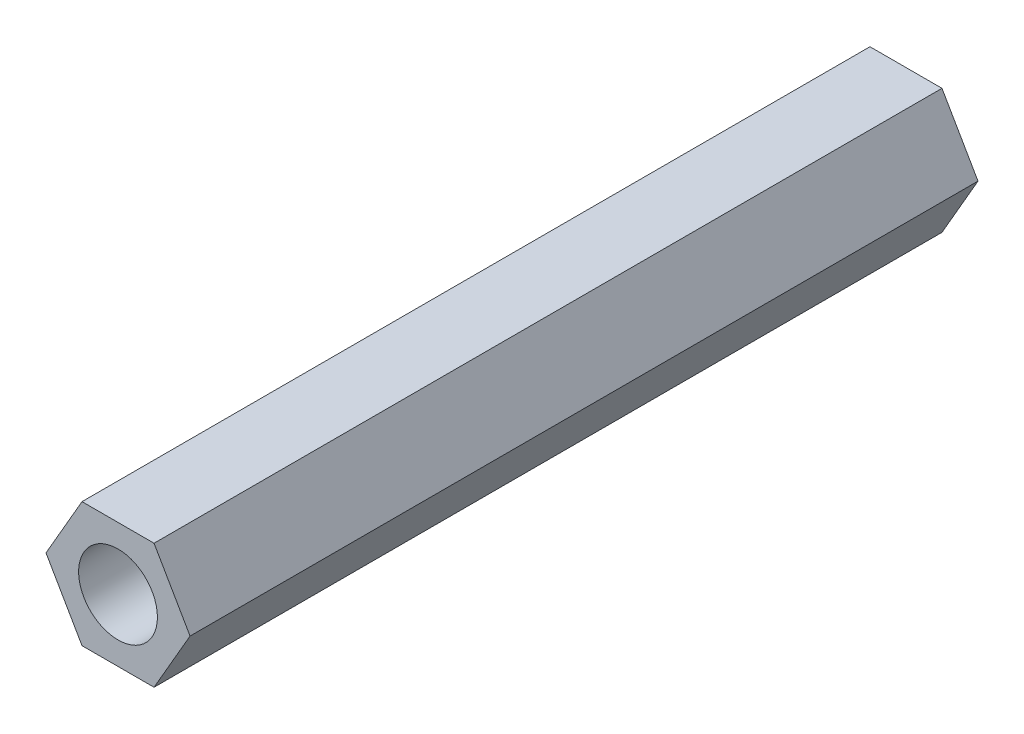
ISO-10303-21;
HEADER;
FILE_DESCRIPTION(('STEP AP214'),'2;1');
FILE_NAME('part.step','',(''),(''),'','','');
FILE_SCHEMA(('AUTOMOTIVE_DESIGN { 1 0 10303 214 1 1 1 1 }'));
ENDSEC;
DATA;
#1=APPLICATION_CONTEXT('core data for automotive mechanical design processes');
#2=APPLICATION_PROTOCOL_DEFINITION('international standard','automotive_design',2000,#1);
#3=PRODUCT_CONTEXT('',#1,'mechanical');
#4=PRODUCT('Part','Part','',(#3));
#5=PRODUCT_RELATED_PRODUCT_CATEGORY('part','',(#4));
#6=PRODUCT_DEFINITION_FORMATION('','',#4);
#7=PRODUCT_DEFINITION_CONTEXT('part definition',#1,'design');
#8=PRODUCT_DEFINITION('design','',#6,#7);
#9=PRODUCT_DEFINITION_SHAPE('','',#8);
#10=(LENGTH_UNIT() NAMED_UNIT(*) SI_UNIT(.MILLI.,.METRE.));
#11=(NAMED_UNIT(*) PLANE_ANGLE_UNIT() SI_UNIT($,.RADIAN.));
#12=(NAMED_UNIT(*) SI_UNIT($,.STERADIAN.) SOLID_ANGLE_UNIT());
#13=UNCERTAINTY_MEASURE_WITH_UNIT(LENGTH_MEASURE(1.E-05),#10,'distance_accuracy_value','');
#14=(GEOMETRIC_REPRESENTATION_CONTEXT(3) GLOBAL_UNCERTAINTY_ASSIGNED_CONTEXT((#13)) GLOBAL_UNIT_ASSIGNED_CONTEXT((#10,
#11,#12)) REPRESENTATION_CONTEXT('',''));
#15=CARTESIAN_POINT('',(0.,0.,0.));
#16=DIRECTION('',(0.,0.,1.));
#17=DIRECTION('',(1.,0.,0.));
#18=AXIS2_PLACEMENT_3D('',#15,#16,#17);
#19=CARTESIAN_POINT('',(0.90719827766866,1.5713135094611,0.));
#20=DIRECTION('',(0.,0.,1.));
#21=DIRECTION('',(1.,0.,0.));
#22=AXIS2_PLACEMENT_3D('',#19,#20,#21);
#23=CYLINDRICAL_SURFACE('',#22,1.5);
#24=CARTESIAN_POINT('',(0.90719827766866,1.5713135094611,0.));
#25=DIRECTION('',(0.,0.,1.));
#26=DIRECTION('',(1.,0.,0.));
#27=AXIS2_PLACEMENT_3D('',#24,#25,#26);
#28=CIRCLE('',#27,1.5);
#29=CARTESIAN_POINT('',(2.4071982776687,1.5713135094611,0.));
#30=VERTEX_POINT('',#29);
#31=EDGE_CURVE('E130',#30,#30,#28,.T.);
#32=ORIENTED_EDGE('',*,*,#31,.F.);
#33=DIRECTION('',(0.,0.,1.));
#34=VECTOR('',#33,1.);
#35=CARTESIAN_POINT('',(2.4071982776687,1.5713135094611,0.));
#36=LINE('',#35,#34);
#37=CARTESIAN_POINT('',(2.4071982776687,1.5713135094611,30.));
#38=VERTEX_POINT('',#37);
#39=EDGE_CURVE('E11',#30,#38,#36,.T.);
#40=ORIENTED_EDGE('',*,*,#39,.T.);
#41=CARTESIAN_POINT('',(0.90719827766866,1.5713135094611,30.));
#42=DIRECTION('',(0.,0.,-1.));
#43=DIRECTION('',(1.,0.,0.));
#44=AXIS2_PLACEMENT_3D('',#41,#42,#43);
#45=CIRCLE('',#44,1.5);
#46=EDGE_CURVE('E141',#38,#38,#45,.T.);
#47=ORIENTED_EDGE('',*,*,#46,.F.);
#48=ORIENTED_EDGE('',*,*,#39,.F.);
#49=EDGE_LOOP('',(#32,#40,#47,#48));
#50=FACE_BOUND('',#49,.T.);
#51=ADVANCED_FACE('F17',(#50),#23,.F.);
#52=CARTESIAN_POINT('',(2.9640086116567,0.3838135094611,15.));
#53=DIRECTION('',(0.866025403784439,-0.5,0.));
#54=DIRECTION('',(0.,0.,-1.));
#55=AXIS2_PLACEMENT_3D('',#52,#53,#54);
#56=PLANE('',#55);
#57=DIRECTION('',(-0.500000000000011,-0.866025403784432,0.));
#58=VECTOR('',#57,1.);
#59=CARTESIAN_POINT('',(3.6496120563194,1.5713135094611,0.));
#60=LINE('',#59,#58);
#61=CARTESIAN_POINT('',(3.6496120563194,1.5713135094611,0.));
#62=VERTEX_POINT('',#61);
#63=CARTESIAN_POINT('',(2.278405166994,-0.8036864905389,0.));
#64=VERTEX_POINT('',#63);
#65=EDGE_CURVE('E264',#62,#64,#60,.T.);
#66=ORIENTED_EDGE('',*,*,#65,.F.);
#67=DIRECTION('',(0.,0.,-1.));
#68=VECTOR('',#67,1.);
#69=CARTESIAN_POINT('',(3.6496120563194,1.5713135094611,30.));
#70=LINE('',#69,#68);
#71=CARTESIAN_POINT('',(3.6496120563194,1.5713135094611,30.));
#72=VERTEX_POINT('',#71);
#73=EDGE_CURVE('E109',#72,#62,#70,.T.);
#74=ORIENTED_EDGE('',*,*,#73,.F.);
#75=DIRECTION('',(0.500000000000011,0.866025403784432,0.));
#76=VECTOR('',#75,1.);
#77=CARTESIAN_POINT('',(2.278405166994,-0.8036864905389,30.));
#78=LINE('',#77,#76);
#79=CARTESIAN_POINT('',(2.278405166994,-0.8036864905389,30.));
#80=VERTEX_POINT('',#79);
#81=EDGE_CURVE('E145',#80,#72,#78,.T.);
#82=ORIENTED_EDGE('',*,*,#81,.F.);
#83=DIRECTION('',(0.,0.,1.));
#84=VECTOR('',#83,1.);
#85=CARTESIAN_POINT('',(2.278405166994,-0.8036864905389,0.));
#86=LINE('',#85,#84);
#87=EDGE_CURVE('E26',#64,#80,#86,.T.);
#88=ORIENTED_EDGE('',*,*,#87,.F.);
#89=EDGE_LOOP('',(#66,#74,#82,#88));
#90=FACE_BOUND('',#89,.T.);
#91=ADVANCED_FACE('F19',(#90),#56,.T.);
#92=CARTESIAN_POINT('',(0.90719827766866,-0.8036864905389,15.));
#93=DIRECTION('',(0.,-1.,0.));
#94=DIRECTION('',(0.,0.,-1.));
#95=AXIS2_PLACEMENT_3D('',#92,#93,#94);
#96=PLANE('',#95);
#97=DIRECTION('',(-1.,0.,0.));
#98=VECTOR('',#97,1.);
#99=CARTESIAN_POINT('',(2.278405166994,-0.8036864905389,0.));
#100=LINE('',#99,#98);
#101=CARTESIAN_POINT('',(-0.4640086116567,-0.80368649053891,0.));
#102=VERTEX_POINT('',#101);
#103=EDGE_CURVE('E269',#64,#102,#100,.T.);
#104=ORIENTED_EDGE('',*,*,#103,.F.);
#105=ORIENTED_EDGE('',*,*,#87,.T.);
#106=DIRECTION('',(1.,0.,0.));
#107=VECTOR('',#106,1.);
#108=CARTESIAN_POINT('',(-0.4640086116567,-0.80368649053891,30.));
#109=LINE('',#108,#107);
#110=CARTESIAN_POINT('',(-0.4640086116567,-0.80368649053891,30.));
#111=VERTEX_POINT('',#110);
#112=EDGE_CURVE('E140',#111,#80,#109,.T.);
#113=ORIENTED_EDGE('',*,*,#112,.F.);
#114=DIRECTION('',(0.,0.,1.));
#115=VECTOR('',#114,1.);
#116=CARTESIAN_POINT('',(-0.4640086116567,-0.80368649053891,0.));
#117=LINE('',#116,#115);
#118=EDGE_CURVE('E150',#102,#111,#117,.T.);
#119=ORIENTED_EDGE('',*,*,#118,.F.);
#120=EDGE_LOOP('',(#104,#105,#113,#119));
#121=FACE_BOUND('',#120,.T.);
#122=ADVANCED_FACE('F205',(#121),#96,.T.);
#123=CARTESIAN_POINT('',(-1.1496120563194,0.3838135094611,15.));
#124=DIRECTION('',(-0.866025403784439,-0.5,0.));
#125=DIRECTION('',(-0.5,0.866025403784439,0.));
#126=AXIS2_PLACEMENT_3D('',#123,#124,#125);
#127=PLANE('',#126);
#128=DIRECTION('',(-0.500000000000011,0.866025403784432,0.));
#129=VECTOR('',#128,1.);
#130=CARTESIAN_POINT('',(-0.4640086116567,-0.80368649053891,0.));
#131=LINE('',#130,#129);
#132=CARTESIAN_POINT('',(-1.8352155009821,1.5713135094611,0.));
#133=VERTEX_POINT('',#132);
#134=EDGE_CURVE('E274',#102,#133,#131,.T.);
#135=ORIENTED_EDGE('',*,*,#134,.F.);
#136=ORIENTED_EDGE('',*,*,#118,.T.);
#137=DIRECTION('',(0.500000000000011,-0.866025403784432,0.));
#138=VECTOR('',#137,1.);
#139=CARTESIAN_POINT('',(-1.8352155009821,1.5713135094611,30.));
#140=LINE('',#139,#138);
#141=CARTESIAN_POINT('',(-1.8352155009821,1.5713135094611,30.));
#142=VERTEX_POINT('',#141);
#143=EDGE_CURVE('E118',#142,#111,#140,.T.);
#144=ORIENTED_EDGE('',*,*,#143,.F.);
#145=DIRECTION('',(0.,0.,1.));
#146=VECTOR('',#145,1.);
#147=CARTESIAN_POINT('',(-1.8352155009821,1.5713135094611,0.));
#148=LINE('',#147,#146);
#149=EDGE_CURVE('E108',#133,#142,#148,.T.);
#150=ORIENTED_EDGE('',*,*,#149,.F.);
#151=EDGE_LOOP('',(#135,#136,#144,#150));
#152=FACE_BOUND('',#151,.T.);
#153=ADVANCED_FACE('F210',(#152),#127,.T.);
#154=CARTESIAN_POINT('',(-1.1496120563194,2.7588135094611,15.));
#155=DIRECTION('',(-0.866025403784439,0.5,0.));
#156=DIRECTION('',(0.,0.,1.));
#157=AXIS2_PLACEMENT_3D('',#154,#155,#156);
#158=PLANE('',#157);
#159=DIRECTION('',(0.500000000000011,0.866025403784432,0.));
#160=VECTOR('',#159,1.);
#161=CARTESIAN_POINT('',(-1.8352155009821,1.5713135094611,0.));
#162=LINE('',#161,#160);
#163=CARTESIAN_POINT('',(-0.4640086116567,3.9463135094611,0.));
#164=VERTEX_POINT('',#163);
#165=EDGE_CURVE('E283',#133,#164,#162,.T.);
#166=ORIENTED_EDGE('',*,*,#165,.F.);
#167=ORIENTED_EDGE('',*,*,#149,.T.);
#168=DIRECTION('',(-0.500000000000011,-0.866025403784432,0.));
#169=VECTOR('',#168,1.);
#170=CARTESIAN_POINT('',(-0.4640086116567,3.9463135094611,30.));
#171=LINE('',#170,#169);
#172=CARTESIAN_POINT('',(-0.4640086116567,3.9463135094611,30.));
#173=VERTEX_POINT('',#172);
#174=EDGE_CURVE('E112',#173,#142,#171,.T.);
#175=ORIENTED_EDGE('',*,*,#174,.F.);
#176=DIRECTION('',(0.,0.,1.));
#177=VECTOR('',#176,1.);
#178=CARTESIAN_POINT('',(-0.4640086116567,3.9463135094611,0.));
#179=LINE('',#178,#177);
#180=EDGE_CURVE('E96',#164,#173,#179,.T.);
#181=ORIENTED_EDGE('',*,*,#180,.F.);
#182=EDGE_LOOP('',(#166,#167,#175,#181));
#183=FACE_BOUND('',#182,.T.);
#184=ADVANCED_FACE('F113',(#183),#158,.T.);
#185=CARTESIAN_POINT('',(0.90719827766866,3.9463135094611,15.));
#186=DIRECTION('',(0.,1.,0.));
#187=DIRECTION('',(1.,0.,0.));
#188=AXIS2_PLACEMENT_3D('',#185,#186,#187);
#189=PLANE('',#188);
#190=DIRECTION('',(1.,0.,0.));
#191=VECTOR('',#190,1.);
#192=CARTESIAN_POINT('',(-0.4640086116567,3.9463135094611,0.));
#193=LINE('',#192,#191);
#194=CARTESIAN_POINT('',(2.278405166994,3.9463135094611,0.));
#195=VERTEX_POINT('',#194);
#196=EDGE_CURVE('E103',#164,#195,#193,.T.);
#197=ORIENTED_EDGE('',*,*,#196,.F.);
#198=ORIENTED_EDGE('',*,*,#180,.T.);
#199=DIRECTION('',(-1.,0.,0.));
#200=VECTOR('',#199,1.);
#201=CARTESIAN_POINT('',(2.278405166994,3.9463135094611,30.));
#202=LINE('',#201,#200);
#203=CARTESIAN_POINT('',(2.278405166994,3.9463135094611,30.));
#204=VERTEX_POINT('',#203);
#205=EDGE_CURVE('E100',#204,#173,#202,.T.);
#206=ORIENTED_EDGE('',*,*,#205,.F.);
#207=DIRECTION('',(0.,0.,1.));
#208=VECTOR('',#207,1.);
#209=CARTESIAN_POINT('',(2.278405166994,3.9463135094611,0.));
#210=LINE('',#209,#208);
#211=EDGE_CURVE('E144',#195,#204,#210,.T.);
#212=ORIENTED_EDGE('',*,*,#211,.F.);
#213=EDGE_LOOP('',(#197,#198,#206,#212));
#214=FACE_BOUND('',#213,.T.);
#215=ADVANCED_FACE('F98',(#214),#189,.T.);
#216=CARTESIAN_POINT('',(2.9640086116567,2.7588135094611,15.));
#217=DIRECTION('',(0.866025403784439,0.5,0.));
#218=DIRECTION('',(0.,0.,-1.));
#219=AXIS2_PLACEMENT_3D('',#216,#217,#218);
#220=PLANE('',#219);
#221=DIRECTION('',(0.500000000000011,-0.866025403784432,0.));
#222=VECTOR('',#221,1.);
#223=CARTESIAN_POINT('',(2.278405166994,3.9463135094611,0.));
#224=LINE('',#223,#222);
#225=EDGE_CURVE('E134',#195,#62,#224,.T.);
#226=ORIENTED_EDGE('',*,*,#225,.F.);
#227=ORIENTED_EDGE('',*,*,#211,.T.);
#228=DIRECTION('',(-0.500000000000011,0.866025403784432,0.));
#229=VECTOR('',#228,1.);
#230=CARTESIAN_POINT('',(3.6496120563194,1.5713135094611,30.));
#231=LINE('',#230,#229);
#232=EDGE_CURVE('E123',#72,#204,#231,.T.);
#233=ORIENTED_EDGE('',*,*,#232,.F.);
#234=ORIENTED_EDGE('',*,*,#73,.T.);
#235=EDGE_LOOP('',(#226,#227,#233,#234));
#236=FACE_BOUND('',#235,.T.);
#237=ADVANCED_FACE('F177',(#236),#220,.T.);
#238=CARTESIAN_POINT('',(0.90719827766866,1.9387272881118,30.));
#239=DIRECTION('',(0.,0.,1.));
#240=DIRECTION('',(1.,0.,0.));
#241=AXIS2_PLACEMENT_3D('',#238,#239,#240);
#242=PLANE('',#241);
#243=ORIENTED_EDGE('',*,*,#46,.T.);
#244=EDGE_LOOP('',(#243));
#245=FACE_BOUND('',#244,.T.);
#246=ORIENTED_EDGE('',*,*,#232,.T.);
#247=ORIENTED_EDGE('',*,*,#205,.T.);
#248=ORIENTED_EDGE('',*,*,#174,.T.);
#249=ORIENTED_EDGE('',*,*,#143,.T.);
#250=ORIENTED_EDGE('',*,*,#112,.T.);
#251=ORIENTED_EDGE('',*,*,#81,.T.);
#252=EDGE_LOOP('',(#246,#247,#248,#249,#250,#251));
#253=FACE_BOUND('',#252,.T.);
#254=ADVANCED_FACE('F120',(#245,#253),#242,.T.);
#255=CARTESIAN_POINT('',(0.90719827766866,1.9387272881118,0.));
#256=DIRECTION('',(0.,0.,-1.));
#257=DIRECTION('',(0.,-1.,0.));
#258=AXIS2_PLACEMENT_3D('',#255,#256,#257);
#259=PLANE('',#258);
#260=ORIENTED_EDGE('',*,*,#31,.T.);
#261=EDGE_LOOP('',(#260));
#262=FACE_BOUND('',#261,.T.);
#263=ORIENTED_EDGE('',*,*,#65,.T.);
#264=ORIENTED_EDGE('',*,*,#103,.T.);
#265=ORIENTED_EDGE('',*,*,#134,.T.);
#266=ORIENTED_EDGE('',*,*,#165,.T.);
#267=ORIENTED_EDGE('',*,*,#196,.T.);
#268=ORIENTED_EDGE('',*,*,#225,.T.);
#269=EDGE_LOOP('',(#263,#264,#265,#266,#267,#268));
#270=FACE_BOUND('',#269,.T.);
#271=ADVANCED_FACE('F159',(#262,#270),#259,.T.);
#272=CLOSED_SHELL('',(#51,#91,#122,#153,#184,#215,#237,#254,#271));
#273=MANIFOLD_SOLID_BREP('B1',#272);
#274=ADVANCED_BREP_SHAPE_REPRESENTATION('',(#18,#273),#14);
#275=SHAPE_DEFINITION_REPRESENTATION(#9,#274);
ENDSEC;
END-ISO-10303-21;
